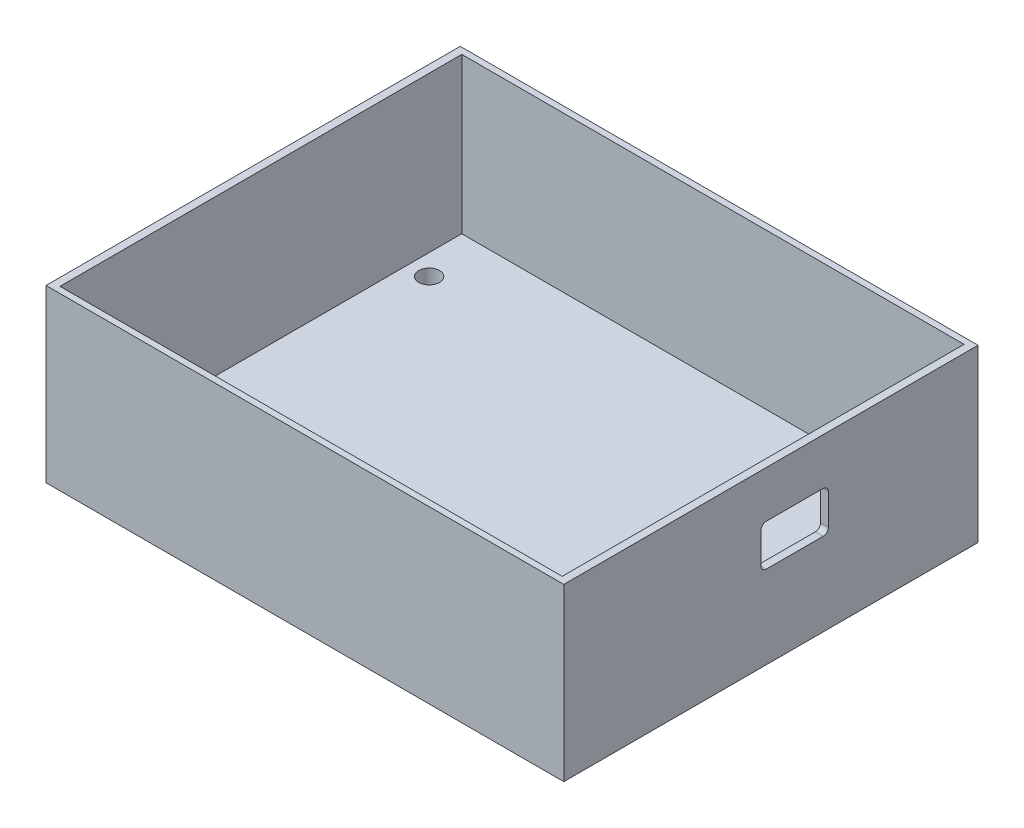
ISO-10303-21;
HEADER;
FILE_DESCRIPTION(('STEP AP214'),'2;1');
FILE_NAME('part.step','',(''),(''),'','','');
FILE_SCHEMA(('AUTOMOTIVE_DESIGN { 1 0 10303 214 1 1 1 1 }'));
ENDSEC;
DATA;
#1=APPLICATION_CONTEXT('core data for automotive mechanical design processes');
#2=APPLICATION_PROTOCOL_DEFINITION('international standard','automotive_design',2000,#1);
#3=PRODUCT_CONTEXT('',#1,'mechanical');
#4=PRODUCT('Part','Part','',(#3));
#5=PRODUCT_RELATED_PRODUCT_CATEGORY('part','',(#4));
#6=PRODUCT_DEFINITION_FORMATION('','',#4);
#7=PRODUCT_DEFINITION_CONTEXT('part definition',#1,'design');
#8=PRODUCT_DEFINITION('design','',#6,#7);
#9=PRODUCT_DEFINITION_SHAPE('','',#8);
#10=(LENGTH_UNIT() NAMED_UNIT(*) SI_UNIT(.MILLI.,.METRE.));
#11=(NAMED_UNIT(*) PLANE_ANGLE_UNIT() SI_UNIT($,.RADIAN.));
#12=(NAMED_UNIT(*) SI_UNIT($,.STERADIAN.) SOLID_ANGLE_UNIT());
#13=UNCERTAINTY_MEASURE_WITH_UNIT(LENGTH_MEASURE(1.E-05),#10,'distance_accuracy_value','');
#14=(GEOMETRIC_REPRESENTATION_CONTEXT(3) GLOBAL_UNCERTAINTY_ASSIGNED_CONTEXT((#13)) GLOBAL_UNIT_ASSIGNED_CONTEXT((#10,
#11,#12)) REPRESENTATION_CONTEXT('',''));
#15=CARTESIAN_POINT('',(0.,0.,0.));
#16=DIRECTION('',(0.,0.,1.));
#17=DIRECTION('',(1.,0.,0.));
#18=AXIS2_PLACEMENT_3D('',#15,#16,#17);
#19=CARTESIAN_POINT('',(40.,17.,-10.1));
#20=DIRECTION('',(-1.,0.,0.));
#21=DIRECTION('',(0.,0.,1.));
#22=AXIS2_PLACEMENT_3D('',#19,#20,#21);
#23=CYLINDRICAL_SURFACE('',#22,1.);
#24=DIRECTION('',(1.,0.,0.));
#25=VECTOR('',#24,1.);
#26=CARTESIAN_POINT('',(40.,17.,-11.1));
#27=LINE('',#26,#25);
#28=CARTESIAN_POINT('',(48.5,17.,-11.1));
#29=VERTEX_POINT('',#28);
#30=CARTESIAN_POINT('',(50.,17.,-11.1));
#31=VERTEX_POINT('',#30);
#32=EDGE_CURVE('E330',#29,#31,#27,.T.);
#33=ORIENTED_EDGE('',*,*,#32,.F.);
#34=CARTESIAN_POINT('',(48.5,17.,-10.1));
#35=DIRECTION('',(-1.,0.,0.));
#36=DIRECTION('',(0.,0.,1.));
#37=AXIS2_PLACEMENT_3D('',#34,#35,#36);
#38=CIRCLE('',#37,1.);
#39=CARTESIAN_POINT('',(48.5,16.,-10.1));
#40=VERTEX_POINT('',#39);
#41=EDGE_CURVE('E39',#29,#40,#38,.T.);
#42=ORIENTED_EDGE('',*,*,#41,.T.);
#43=DIRECTION('',(1.,0.,0.));
#44=VECTOR('',#43,1.);
#45=CARTESIAN_POINT('',(40.,16.,-10.1));
#46=LINE('',#45,#44);
#47=CARTESIAN_POINT('',(50.,16.,-10.1));
#48=VERTEX_POINT('',#47);
#49=EDGE_CURVE('E333',#48,#40,#46,.F.);
#50=ORIENTED_EDGE('',*,*,#49,.F.);
#51=CARTESIAN_POINT('',(50.,17.,-10.1));
#52=DIRECTION('',(-1.,0.,0.));
#53=DIRECTION('',(0.,0.,1.));
#54=AXIS2_PLACEMENT_3D('',#51,#52,#53);
#55=CIRCLE('',#54,1.);
#56=EDGE_CURVE('E11',#48,#31,#55,.F.);
#57=ORIENTED_EDGE('',*,*,#56,.T.);
#58=EDGE_LOOP('',(#33,#42,#50,#57));
#59=FACE_BOUND('',#58,.T.);
#60=ADVANCED_FACE('F32',(#59),#23,.F.);
#61=CARTESIAN_POINT('',(40.,17.,0.899999999999994));
#62=DIRECTION('',(-1.,0.,0.));
#63=DIRECTION('',(0.,0.,1.));
#64=AXIS2_PLACEMENT_3D('',#61,#62,#63);
#65=CYLINDRICAL_SURFACE('',#64,1.);
#66=DIRECTION('',(1.,0.,0.));
#67=VECTOR('',#66,1.);
#68=CARTESIAN_POINT('',(40.,16.,0.899999999999994));
#69=LINE('',#68,#67);
#70=CARTESIAN_POINT('',(48.5,16.,0.899999999999998));
#71=VERTEX_POINT('',#70);
#72=CARTESIAN_POINT('',(50.,16.,0.899999999999994));
#73=VERTEX_POINT('',#72);
#74=EDGE_CURVE('E320',#71,#73,#69,.T.);
#75=ORIENTED_EDGE('',*,*,#74,.F.);
#76=CARTESIAN_POINT('',(48.5,17.,0.899999999999994));
#77=DIRECTION('',(-1.,0.,0.));
#78=DIRECTION('',(0.,0.,1.));
#79=AXIS2_PLACEMENT_3D('',#76,#77,#78);
#80=CIRCLE('',#79,1.);
#81=CARTESIAN_POINT('',(48.5,17.,1.89999999999999));
#82=VERTEX_POINT('',#81);
#83=EDGE_CURVE('E326',#71,#82,#80,.T.);
#84=ORIENTED_EDGE('',*,*,#83,.T.);
#85=DIRECTION('',(1.,0.,0.));
#86=VECTOR('',#85,1.);
#87=CARTESIAN_POINT('',(40.,17.,1.89999999999999));
#88=LINE('',#87,#86);
#89=CARTESIAN_POINT('',(50.,17.,1.89999999999999));
#90=VERTEX_POINT('',#89);
#91=EDGE_CURVE('E323',#90,#82,#88,.F.);
#92=ORIENTED_EDGE('',*,*,#91,.F.);
#93=CARTESIAN_POINT('',(50.,17.,0.899999999999994));
#94=DIRECTION('',(-1.,0.,0.));
#95=DIRECTION('',(0.,0.,1.));
#96=AXIS2_PLACEMENT_3D('',#93,#94,#95);
#97=CIRCLE('',#96,1.);
#98=EDGE_CURVE('E328',#90,#73,#97,.F.);
#99=ORIENTED_EDGE('',*,*,#98,.T.);
#100=EDGE_LOOP('',(#75,#84,#92,#99));
#101=FACE_BOUND('',#100,.T.);
#102=ADVANCED_FACE('F349',(#101),#65,.F.);
#103=CARTESIAN_POINT('',(40.,23.,0.899999999999994));
#104=DIRECTION('',(-1.,0.,0.));
#105=DIRECTION('',(0.,0.,1.));
#106=AXIS2_PLACEMENT_3D('',#103,#104,#105);
#107=CYLINDRICAL_SURFACE('',#106,1.);
#108=DIRECTION('',(1.,0.,0.));
#109=VECTOR('',#108,1.);
#110=CARTESIAN_POINT('',(40.,23.,1.89999999999999));
#111=LINE('',#110,#109);
#112=CARTESIAN_POINT('',(48.5,23.,1.89999999999999));
#113=VERTEX_POINT('',#112);
#114=CARTESIAN_POINT('',(50.,23.,1.89999999999999));
#115=VERTEX_POINT('',#114);
#116=EDGE_CURVE('E310',#113,#115,#111,.T.);
#117=ORIENTED_EDGE('',*,*,#116,.F.);
#118=CARTESIAN_POINT('',(48.5,23.,0.899999999999994));
#119=DIRECTION('',(-1.,0.,0.));
#120=DIRECTION('',(0.,0.,1.));
#121=AXIS2_PLACEMENT_3D('',#118,#119,#120);
#122=CIRCLE('',#121,1.);
#123=CARTESIAN_POINT('',(48.5,24.,0.899999999999998));
#124=VERTEX_POINT('',#123);
#125=EDGE_CURVE('E316',#113,#124,#122,.T.);
#126=ORIENTED_EDGE('',*,*,#125,.T.);
#127=DIRECTION('',(1.,0.,0.));
#128=VECTOR('',#127,1.);
#129=CARTESIAN_POINT('',(40.,24.,0.899999999999994));
#130=LINE('',#129,#128);
#131=CARTESIAN_POINT('',(50.,24.,0.899999999999994));
#132=VERTEX_POINT('',#131);
#133=EDGE_CURVE('E313',#132,#124,#130,.F.);
#134=ORIENTED_EDGE('',*,*,#133,.F.);
#135=CARTESIAN_POINT('',(50.,23.,0.899999999999994));
#136=DIRECTION('',(-1.,0.,0.));
#137=DIRECTION('',(0.,0.,1.));
#138=AXIS2_PLACEMENT_3D('',#135,#136,#137);
#139=CIRCLE('',#138,1.);
#140=EDGE_CURVE('E318',#132,#115,#139,.F.);
#141=ORIENTED_EDGE('',*,*,#140,.T.);
#142=EDGE_LOOP('',(#117,#126,#134,#141));
#143=FACE_BOUND('',#142,.T.);
#144=ADVANCED_FACE('F408',(#143),#107,.F.);
#145=CARTESIAN_POINT('',(40.,23.,-10.1));
#146=DIRECTION('',(1.,0.,0.));
#147=DIRECTION('',(0.,0.,-1.));
#148=AXIS2_PLACEMENT_3D('',#145,#146,#147);
#149=CYLINDRICAL_SURFACE('',#148,1.);
#150=DIRECTION('',(-1.,0.,0.));
#151=VECTOR('',#150,1.);
#152=CARTESIAN_POINT('',(40.,23.,-11.1));
#153=LINE('',#152,#151);
#154=CARTESIAN_POINT('',(50.,23.,-11.1));
#155=VERTEX_POINT('',#154);
#156=CARTESIAN_POINT('',(48.5,23.,-11.1));
#157=VERTEX_POINT('',#156);
#158=EDGE_CURVE('E300',#155,#157,#153,.T.);
#159=ORIENTED_EDGE('',*,*,#158,.F.);
#160=CARTESIAN_POINT('',(50.,23.,-10.1));
#161=DIRECTION('',(-1.,0.,0.));
#162=DIRECTION('',(0.,0.,1.));
#163=AXIS2_PLACEMENT_3D('',#160,#161,#162);
#164=CIRCLE('',#163,1.);
#165=CARTESIAN_POINT('',(50.,24.,-10.1));
#166=VERTEX_POINT('',#165);
#167=EDGE_CURVE('E306',#155,#166,#164,.F.);
#168=ORIENTED_EDGE('',*,*,#167,.T.);
#169=DIRECTION('',(-1.,0.,0.));
#170=VECTOR('',#169,1.);
#171=CARTESIAN_POINT('',(40.,24.,-10.1));
#172=LINE('',#171,#170);
#173=CARTESIAN_POINT('',(48.5,24.,-10.1));
#174=VERTEX_POINT('',#173);
#175=EDGE_CURVE('E303',#174,#166,#172,.F.);
#176=ORIENTED_EDGE('',*,*,#175,.F.);
#177=CARTESIAN_POINT('',(48.5,23.,-10.1));
#178=DIRECTION('',(-1.,0.,0.));
#179=DIRECTION('',(0.,0.,1.));
#180=AXIS2_PLACEMENT_3D('',#177,#178,#179);
#181=CIRCLE('',#180,1.);
#182=EDGE_CURVE('E308',#174,#157,#181,.T.);
#183=ORIENTED_EDGE('',*,*,#182,.T.);
#184=EDGE_LOOP('',(#159,#168,#176,#183));
#185=FACE_BOUND('',#184,.T.);
#186=ADVANCED_FACE('F416',(#185),#149,.F.);
#187=CARTESIAN_POINT('',(50.,3.,40.));
#188=DIRECTION('',(-1.,0.,0.));
#189=DIRECTION('',(0.,0.,1.));
#190=AXIS2_PLACEMENT_3D('',#187,#188,#189);
#191=PLANE('',#190);
#192=DIRECTION('',(0.,0.,1.));
#193=VECTOR('',#192,1.);
#194=CARTESIAN_POINT('',(50.,24.,1.89999999999999));
#195=LINE('',#194,#193);
#196=EDGE_CURVE('E359',#166,#132,#195,.T.);
#197=ORIENTED_EDGE('',*,*,#196,.F.);
#198=ORIENTED_EDGE('',*,*,#167,.F.);
#199=DIRECTION('',(0.,1.,0.));
#200=VECTOR('',#199,1.);
#201=CARTESIAN_POINT('',(50.,16.,-11.1));
#202=LINE('',#201,#200);
#203=EDGE_CURVE('E422',#31,#155,#202,.T.);
#204=ORIENTED_EDGE('',*,*,#203,.F.);
#205=ORIENTED_EDGE('',*,*,#56,.F.);
#206=DIRECTION('',(0.,0.,-1.));
#207=VECTOR('',#206,1.);
#208=CARTESIAN_POINT('',(50.,16.,1.89999999999999));
#209=LINE('',#208,#207);
#210=EDGE_CURVE('E339',#73,#48,#209,.T.);
#211=ORIENTED_EDGE('',*,*,#210,.F.);
#212=ORIENTED_EDGE('',*,*,#98,.F.);
#213=DIRECTION('',(0.,-1.,0.));
#214=VECTOR('',#213,1.);
#215=CARTESIAN_POINT('',(50.,16.,1.89999999999999));
#216=LINE('',#215,#214);
#217=EDGE_CURVE('E354',#115,#90,#216,.T.);
#218=ORIENTED_EDGE('',*,*,#217,.F.);
#219=ORIENTED_EDGE('',*,*,#140,.F.);
#220=EDGE_LOOP('',(#197,#198,#204,#205,#211,#212,#218,#219));
#221=FACE_BOUND('',#220,.T.);
#222=DIRECTION('',(0.,0.,-1.));
#223=VECTOR('',#222,1.);
#224=CARTESIAN_POINT('',(50.,0.,40.));
#225=LINE('',#224,#223);
#226=CARTESIAN_POINT('',(50.,0.,40.));
#227=VERTEX_POINT('',#226);
#228=CARTESIAN_POINT('',(50.,0.,-40.));
#229=VERTEX_POINT('',#228);
#230=EDGE_CURVE('E258',#227,#229,#225,.T.);
#231=ORIENTED_EDGE('',*,*,#230,.T.);
#232=DIRECTION('',(0.,-1.,0.));
#233=VECTOR('',#232,1.);
#234=CARTESIAN_POINT('',(50.,3.,-40.));
#235=LINE('',#234,#233);
#236=CARTESIAN_POINT('',(50.,33.,-40.));
#237=VERTEX_POINT('',#236);
#238=EDGE_CURVE('E276',#237,#229,#235,.T.);
#239=ORIENTED_EDGE('',*,*,#238,.F.);
#240=DIRECTION('',(0.,0.,-1.));
#241=VECTOR('',#240,1.);
#242=CARTESIAN_POINT('',(50.,33.,40.));
#243=LINE('',#242,#241);
#244=CARTESIAN_POINT('',(50.,33.,40.));
#245=VERTEX_POINT('',#244);
#246=EDGE_CURVE('E246',#245,#237,#243,.T.);
#247=ORIENTED_EDGE('',*,*,#246,.F.);
#248=DIRECTION('',(0.,-1.,0.));
#249=VECTOR('',#248,1.);
#250=CARTESIAN_POINT('',(50.,3.,40.));
#251=LINE('',#250,#249);
#252=EDGE_CURVE('E267',#245,#227,#251,.T.);
#253=ORIENTED_EDGE('',*,*,#252,.T.);
#254=EDGE_LOOP('',(#231,#239,#247,#253));
#255=FACE_BOUND('',#254,.T.);
#256=ADVANCED_FACE('F351',(#221,#255),#191,.F.);
#257=CARTESIAN_POINT('',(-50.,3.,-40.));
#258=DIRECTION('',(0.,0.,1.));
#259=DIRECTION('',(1.,0.,0.));
#260=AXIS2_PLACEMENT_3D('',#257,#258,#259);
#261=PLANE('',#260);
#262=DIRECTION('',(-1.,0.,0.));
#263=VECTOR('',#262,1.);
#264=CARTESIAN_POINT('',(-50.,0.,-40.));
#265=LINE('',#264,#263);
#266=CARTESIAN_POINT('',(-50.,0.,-40.));
#267=VERTEX_POINT('',#266);
#268=EDGE_CURVE('E261',#229,#267,#265,.T.);
#269=ORIENTED_EDGE('',*,*,#268,.T.);
#270=DIRECTION('',(0.,-1.,0.));
#271=VECTOR('',#270,1.);
#272=CARTESIAN_POINT('',(-50.,3.,-40.));
#273=LINE('',#272,#271);
#274=CARTESIAN_POINT('',(-50.,33.,-40.));
#275=VERTEX_POINT('',#274);
#276=EDGE_CURVE('E273',#275,#267,#273,.T.);
#277=ORIENTED_EDGE('',*,*,#276,.F.);
#278=DIRECTION('',(-1.,0.,0.));
#279=VECTOR('',#278,1.);
#280=CARTESIAN_POINT('',(-50.,33.,-40.));
#281=LINE('',#280,#279);
#282=EDGE_CURVE('E249',#237,#275,#281,.T.);
#283=ORIENTED_EDGE('',*,*,#282,.F.);
#284=ORIENTED_EDGE('',*,*,#238,.T.);
#285=EDGE_LOOP('',(#269,#277,#283,#284));
#286=FACE_BOUND('',#285,.T.);
#287=ADVANCED_FACE('F555',(#286),#261,.F.);
#288=CARTESIAN_POINT('',(-50.,3.,40.));
#289=DIRECTION('',(1.,0.,0.));
#290=DIRECTION('',(0.,0.,-1.));
#291=AXIS2_PLACEMENT_3D('',#288,#289,#290);
#292=PLANE('',#291);
#293=DIRECTION('',(0.,0.,1.));
#294=VECTOR('',#293,1.);
#295=CARTESIAN_POINT('',(-50.,0.,40.));
#296=LINE('',#295,#294);
#297=CARTESIAN_POINT('',(-50.,0.,40.));
#298=VERTEX_POINT('',#297);
#299=EDGE_CURVE('E263',#267,#298,#296,.T.);
#300=ORIENTED_EDGE('',*,*,#299,.T.);
#301=DIRECTION('',(0.,-1.,0.));
#302=VECTOR('',#301,1.);
#303=CARTESIAN_POINT('',(-50.,3.,40.));
#304=LINE('',#303,#302);
#305=CARTESIAN_POINT('',(-50.,33.,40.));
#306=VERTEX_POINT('',#305);
#307=EDGE_CURVE('E270',#306,#298,#304,.T.);
#308=ORIENTED_EDGE('',*,*,#307,.F.);
#309=DIRECTION('',(0.,0.,1.));
#310=VECTOR('',#309,1.);
#311=CARTESIAN_POINT('',(-50.,33.,40.));
#312=LINE('',#311,#310);
#313=EDGE_CURVE('E252',#275,#306,#312,.T.);
#314=ORIENTED_EDGE('',*,*,#313,.F.);
#315=ORIENTED_EDGE('',*,*,#276,.T.);
#316=EDGE_LOOP('',(#300,#308,#314,#315));
#317=FACE_BOUND('',#316,.T.);
#318=ADVANCED_FACE('F607',(#317),#292,.F.);
#319=CARTESIAN_POINT('',(-50.,3.,40.));
#320=DIRECTION('',(0.,0.,-1.));
#321=DIRECTION('',(-1.,0.,0.));
#322=AXIS2_PLACEMENT_3D('',#319,#320,#321);
#323=PLANE('',#322);
#324=DIRECTION('',(1.,0.,0.));
#325=VECTOR('',#324,1.);
#326=CARTESIAN_POINT('',(-50.,0.,40.));
#327=LINE('',#326,#325);
#328=EDGE_CURVE('E265',#298,#227,#327,.T.);
#329=ORIENTED_EDGE('',*,*,#328,.T.);
#330=ORIENTED_EDGE('',*,*,#252,.F.);
#331=DIRECTION('',(1.,0.,0.));
#332=VECTOR('',#331,1.);
#333=CARTESIAN_POINT('',(-50.,33.,40.));
#334=LINE('',#333,#332);
#335=EDGE_CURVE('E255',#306,#245,#334,.T.);
#336=ORIENTED_EDGE('',*,*,#335,.F.);
#337=ORIENTED_EDGE('',*,*,#307,.T.);
#338=EDGE_LOOP('',(#329,#330,#336,#337));
#339=FACE_BOUND('',#338,.T.);
#340=ADVANCED_FACE('F597',(#339),#323,.F.);
#341=CARTESIAN_POINT('',(0.,0.,0.));
#342=DIRECTION('',(0.,-1.,0.));
#343=DIRECTION('',(0.,0.,-1.));
#344=AXIS2_PLACEMENT_3D('',#341,#342,#343);
#345=PLANE('',#344);
#346=DIRECTION('',(0.,0.,-1.));
#347=VECTOR('',#346,1.);
#348=CARTESIAN_POINT('',(-47.5,0.,0.));
#349=LINE('',#348,#347);
#350=CARTESIAN_POINT('',(-47.5,0.,37.5));
#351=VERTEX_POINT('',#350);
#352=CARTESIAN_POINT('',(-47.5,0.,-37.5));
#353=VERTEX_POINT('',#352);
#354=EDGE_CURVE('E214',#351,#353,#349,.T.);
#355=ORIENTED_EDGE('',*,*,#354,.F.);
#356=DIRECTION('',(-1.,0.,0.));
#357=VECTOR('',#356,1.);
#358=CARTESIAN_POINT('',(0.,0.,37.5));
#359=LINE('',#358,#357);
#360=CARTESIAN_POINT('',(47.5,0.,37.5));
#361=VERTEX_POINT('',#360);
#362=EDGE_CURVE('E172',#361,#351,#359,.T.);
#363=ORIENTED_EDGE('',*,*,#362,.F.);
#364=DIRECTION('',(0.,0.,1.));
#365=VECTOR('',#364,1.);
#366=CARTESIAN_POINT('',(47.5,0.,0.));
#367=LINE('',#366,#365);
#368=CARTESIAN_POINT('',(47.5,0.,-37.5));
#369=VERTEX_POINT('',#368);
#370=EDGE_CURVE('E208',#369,#361,#367,.T.);
#371=ORIENTED_EDGE('',*,*,#370,.F.);
#372=DIRECTION('',(1.,0.,0.));
#373=VECTOR('',#372,1.);
#374=CARTESIAN_POINT('',(0.,0.,-37.5));
#375=LINE('',#374,#373);
#376=EDGE_CURVE('E211',#353,#369,#375,.T.);
#377=ORIENTED_EDGE('',*,*,#376,.F.);
#378=EDGE_LOOP('',(#355,#363,#371,#377));
#379=FACE_BOUND('',#378,.T.);
#380=ORIENTED_EDGE('',*,*,#230,.F.);
#381=ORIENTED_EDGE('',*,*,#328,.F.);
#382=ORIENTED_EDGE('',*,*,#299,.F.);
#383=ORIENTED_EDGE('',*,*,#268,.F.);
#384=EDGE_LOOP('',(#380,#381,#382,#383));
#385=FACE_BOUND('',#384,.T.);
#386=ADVANCED_FACE('F595',(#379,#385),#345,.T.);
#387=CARTESIAN_POINT('',(0.,33.,0.));
#388=DIRECTION('',(0.,-1.,0.));
#389=DIRECTION('',(0.,0.,-1.));
#390=AXIS2_PLACEMENT_3D('',#387,#388,#389);
#391=PLANE('',#390);
#392=ORIENTED_EDGE('',*,*,#246,.T.);
#393=ORIENTED_EDGE('',*,*,#282,.T.);
#394=ORIENTED_EDGE('',*,*,#313,.T.);
#395=ORIENTED_EDGE('',*,*,#335,.T.);
#396=EDGE_LOOP('',(#392,#393,#394,#395));
#397=FACE_BOUND('',#396,.T.);
#398=DIRECTION('',(0.,0.,-1.));
#399=VECTOR('',#398,1.);
#400=CARTESIAN_POINT('',(48.5,33.,38.8));
#401=LINE('',#400,#399);
#402=CARTESIAN_POINT('',(48.5,33.,38.8));
#403=VERTEX_POINT('',#402);
#404=CARTESIAN_POINT('',(48.5,33.,-38.8));
#405=VERTEX_POINT('',#404);
#406=EDGE_CURVE('E217',#403,#405,#401,.T.);
#407=ORIENTED_EDGE('',*,*,#406,.F.);
#408=DIRECTION('',(1.,0.,0.));
#409=VECTOR('',#408,1.);
#410=CARTESIAN_POINT('',(-48.5,33.,38.8));
#411=LINE('',#410,#409);
#412=CARTESIAN_POINT('',(-48.5,33.,38.8));
#413=VERTEX_POINT('',#412);
#414=EDGE_CURVE('E225',#413,#403,#411,.T.);
#415=ORIENTED_EDGE('',*,*,#414,.F.);
#416=DIRECTION('',(0.,0.,1.));
#417=VECTOR('',#416,1.);
#418=CARTESIAN_POINT('',(-48.5,33.,38.8));
#419=LINE('',#418,#417);
#420=CARTESIAN_POINT('',(-48.5,33.,-38.8));
#421=VERTEX_POINT('',#420);
#422=EDGE_CURVE('E222',#421,#413,#419,.T.);
#423=ORIENTED_EDGE('',*,*,#422,.F.);
#424=DIRECTION('',(-1.,0.,0.));
#425=VECTOR('',#424,1.);
#426=CARTESIAN_POINT('',(-48.5,33.,-38.8));
#427=LINE('',#426,#425);
#428=EDGE_CURVE('E219',#405,#421,#427,.T.);
#429=ORIENTED_EDGE('',*,*,#428,.F.);
#430=EDGE_LOOP('',(#407,#415,#423,#429));
#431=FACE_BOUND('',#430,.T.);
#432=ADVANCED_FACE('F393',(#397,#431),#391,.F.);
#433=CARTESIAN_POINT('',(48.5,33.,38.8));
#434=DIRECTION('',(-1.,0.,0.));
#435=DIRECTION('',(0.,0.,1.));
#436=AXIS2_PLACEMENT_3D('',#433,#434,#435);
#437=PLANE('',#436);
#438=DIRECTION('',(0.,-1.,0.));
#439=VECTOR('',#438,1.);
#440=CARTESIAN_POINT('',(48.5,33.,-11.1));
#441=LINE('',#440,#439);
#442=EDGE_CURVE('E297',#157,#29,#441,.T.);
#443=ORIENTED_EDGE('',*,*,#442,.F.);
#444=ORIENTED_EDGE('',*,*,#182,.F.);
#445=DIRECTION('',(0.,0.,-1.));
#446=VECTOR('',#445,1.);
#447=CARTESIAN_POINT('',(48.5,24.,38.8));
#448=LINE('',#447,#446);
#449=EDGE_CURVE('E278',#124,#174,#448,.T.);
#450=ORIENTED_EDGE('',*,*,#449,.F.);
#451=ORIENTED_EDGE('',*,*,#125,.F.);
#452=DIRECTION('',(0.,1.,0.));
#453=VECTOR('',#452,1.);
#454=CARTESIAN_POINT('',(48.5,33.,1.89999999999999));
#455=LINE('',#454,#453);
#456=EDGE_CURVE('E293',#82,#113,#455,.T.);
#457=ORIENTED_EDGE('',*,*,#456,.F.);
#458=ORIENTED_EDGE('',*,*,#83,.F.);
#459=DIRECTION('',(0.,0.,1.));
#460=VECTOR('',#459,1.);
#461=CARTESIAN_POINT('',(48.5,16.,38.8));
#462=LINE('',#461,#460);
#463=EDGE_CURVE('E295',#40,#71,#462,.T.);
#464=ORIENTED_EDGE('',*,*,#463,.F.);
#465=ORIENTED_EDGE('',*,*,#41,.F.);
#466=EDGE_LOOP('',(#443,#444,#450,#451,#457,#458,#464,#465));
#467=FACE_BOUND('',#466,.T.);
#468=DIRECTION('',(0.,0.,-1.));
#469=VECTOR('',#468,1.);
#470=CARTESIAN_POINT('',(48.5,3.,38.8));
#471=LINE('',#470,#469);
#472=CARTESIAN_POINT('',(48.5,3.,38.8));
#473=VERTEX_POINT('',#472);
#474=CARTESIAN_POINT('',(48.5,3.,-38.8));
#475=VERTEX_POINT('',#474);
#476=EDGE_CURVE('E216',#473,#475,#471,.T.);
#477=ORIENTED_EDGE('',*,*,#476,.F.);
#478=DIRECTION('',(0.,-1.,0.));
#479=VECTOR('',#478,1.);
#480=CARTESIAN_POINT('',(48.5,33.,38.8));
#481=LINE('',#480,#479);
#482=EDGE_CURVE('E227',#403,#473,#481,.T.);
#483=ORIENTED_EDGE('',*,*,#482,.F.);
#484=ORIENTED_EDGE('',*,*,#406,.T.);
#485=DIRECTION('',(0.,-1.,0.));
#486=VECTOR('',#485,1.);
#487=CARTESIAN_POINT('',(48.5,33.,-38.8));
#488=LINE('',#487,#486);
#489=EDGE_CURVE('E243',#405,#475,#488,.T.);
#490=ORIENTED_EDGE('',*,*,#489,.T.);
#491=EDGE_LOOP('',(#477,#483,#484,#490));
#492=FACE_BOUND('',#491,.T.);
#493=ADVANCED_FACE('F342',(#467,#492),#437,.T.);
#494=CARTESIAN_POINT('',(-48.5,33.,-38.8));
#495=DIRECTION('',(0.,0.,1.));
#496=DIRECTION('',(1.,0.,0.));
#497=AXIS2_PLACEMENT_3D('',#494,#495,#496);
#498=PLANE('',#497);
#499=DIRECTION('',(-1.,0.,0.));
#500=VECTOR('',#499,1.);
#501=CARTESIAN_POINT('',(-48.5,3.,-38.8));
#502=LINE('',#501,#500);
#503=CARTESIAN_POINT('',(-48.5,3.,-38.8));
#504=VERTEX_POINT('',#503);
#505=EDGE_CURVE('E230',#475,#504,#502,.T.);
#506=ORIENTED_EDGE('',*,*,#505,.F.);
#507=ORIENTED_EDGE('',*,*,#489,.F.);
#508=ORIENTED_EDGE('',*,*,#428,.T.);
#509=DIRECTION('',(0.,-1.,0.));
#510=VECTOR('',#509,1.);
#511=CARTESIAN_POINT('',(-48.5,33.,-38.8));
#512=LINE('',#511,#510);
#513=EDGE_CURVE('E241',#421,#504,#512,.T.);
#514=ORIENTED_EDGE('',*,*,#513,.T.);
#515=EDGE_LOOP('',(#506,#507,#508,#514));
#516=FACE_BOUND('',#515,.T.);
#517=ADVANCED_FACE('F389',(#516),#498,.T.);
#518=CARTESIAN_POINT('',(-48.5,33.,38.8));
#519=DIRECTION('',(1.,0.,0.));
#520=DIRECTION('',(0.,0.,-1.));
#521=AXIS2_PLACEMENT_3D('',#518,#519,#520);
#522=PLANE('',#521);
#523=DIRECTION('',(0.,0.,1.));
#524=VECTOR('',#523,1.);
#525=CARTESIAN_POINT('',(-48.5,3.,38.8));
#526=LINE('',#525,#524);
#527=CARTESIAN_POINT('',(-48.5,3.,38.8));
#528=VERTEX_POINT('',#527);
#529=EDGE_CURVE('E233',#504,#528,#526,.T.);
#530=ORIENTED_EDGE('',*,*,#529,.F.);
#531=ORIENTED_EDGE('',*,*,#513,.F.);
#532=ORIENTED_EDGE('',*,*,#422,.T.);
#533=DIRECTION('',(0.,-1.,0.));
#534=VECTOR('',#533,1.);
#535=CARTESIAN_POINT('',(-48.5,33.,38.8));
#536=LINE('',#535,#534);
#537=EDGE_CURVE('E239',#413,#528,#536,.T.);
#538=ORIENTED_EDGE('',*,*,#537,.T.);
#539=EDGE_LOOP('',(#530,#531,#532,#538));
#540=FACE_BOUND('',#539,.T.);
#541=ADVANCED_FACE('F395',(#540),#522,.T.);
#542=CARTESIAN_POINT('',(-48.5,33.,38.8));
#543=DIRECTION('',(0.,0.,-1.));
#544=DIRECTION('',(-1.,0.,0.));
#545=AXIS2_PLACEMENT_3D('',#542,#543,#544);
#546=PLANE('',#545);
#547=DIRECTION('',(1.,0.,0.));
#548=VECTOR('',#547,1.);
#549=CARTESIAN_POINT('',(-48.5,3.,38.8));
#550=LINE('',#549,#548);
#551=EDGE_CURVE('E220',#528,#473,#550,.T.);
#552=ORIENTED_EDGE('',*,*,#551,.F.);
#553=ORIENTED_EDGE('',*,*,#537,.F.);
#554=ORIENTED_EDGE('',*,*,#414,.T.);
#555=ORIENTED_EDGE('',*,*,#482,.T.);
#556=EDGE_LOOP('',(#552,#553,#554,#555));
#557=FACE_BOUND('',#556,.T.);
#558=ADVANCED_FACE('F373',(#557),#546,.T.);
#559=CARTESIAN_POINT('',(0.,3.,0.));
#560=DIRECTION('',(0.,-1.,0.));
#561=DIRECTION('',(0.,0.,-1.));
#562=AXIS2_PLACEMENT_3D('',#559,#560,#561);
#563=PLANE('',#562);
#564=CARTESIAN_POINT('',(44.5,3.,28.5));
#565=DIRECTION('',(0.,1.,0.));
#566=DIRECTION('',(0.,0.,1.));
#567=AXIS2_PLACEMENT_3D('',#564,#565,#566);
#568=CIRCLE('',#567,2.);
#569=CARTESIAN_POINT('',(44.5,3.,30.5));
#570=VERTEX_POINT('',#569);
#571=EDGE_CURVE('E291',#570,#570,#568,.T.);
#572=ORIENTED_EDGE('',*,*,#571,.F.);
#573=EDGE_LOOP('',(#572));
#574=FACE_BOUND('',#573,.T.);
#575=CARTESIAN_POINT('',(-44.5,3.,28.5));
#576=DIRECTION('',(0.,1.,0.));
#577=DIRECTION('',(0.,0.,1.));
#578=AXIS2_PLACEMENT_3D('',#575,#576,#577);
#579=CIRCLE('',#578,2.);
#580=CARTESIAN_POINT('',(-44.5,3.,30.5));
#581=VERTEX_POINT('',#580);
#582=EDGE_CURVE('E287',#581,#581,#579,.T.);
#583=ORIENTED_EDGE('',*,*,#582,.F.);
#584=EDGE_LOOP('',(#583));
#585=FACE_BOUND('',#584,.T.);
#586=CARTESIAN_POINT('',(44.5,3.,-28.5));
#587=DIRECTION('',(0.,1.,0.));
#588=DIRECTION('',(0.,0.,1.));
#589=AXIS2_PLACEMENT_3D('',#586,#587,#588);
#590=CIRCLE('',#589,2.);
#591=CARTESIAN_POINT('',(44.5,3.,-26.5));
#592=VERTEX_POINT('',#591);
#593=EDGE_CURVE('E283',#592,#592,#590,.T.);
#594=ORIENTED_EDGE('',*,*,#593,.F.);
#595=EDGE_LOOP('',(#594));
#596=FACE_BOUND('',#595,.T.);
#597=CARTESIAN_POINT('',(-44.5,3.,-28.5));
#598=DIRECTION('',(0.,1.,0.));
#599=DIRECTION('',(0.,0.,1.));
#600=AXIS2_PLACEMENT_3D('',#597,#598,#599);
#601=CIRCLE('',#600,2.);
#602=CARTESIAN_POINT('',(-44.5,3.,-26.5));
#603=VERTEX_POINT('',#602);
#604=EDGE_CURVE('E195',#603,#603,#601,.T.);
#605=ORIENTED_EDGE('',*,*,#604,.F.);
#606=EDGE_LOOP('',(#605));
#607=FACE_BOUND('',#606,.T.);
#608=ORIENTED_EDGE('',*,*,#551,.T.);
#609=ORIENTED_EDGE('',*,*,#476,.T.);
#610=ORIENTED_EDGE('',*,*,#505,.T.);
#611=ORIENTED_EDGE('',*,*,#529,.T.);
#612=EDGE_LOOP('',(#608,#609,#610,#611));
#613=FACE_BOUND('',#612,.T.);
#614=ADVANCED_FACE('F370',(#574,#585,#596,#607,#613),#563,.F.);
#615=CARTESIAN_POINT('',(-47.5,-1.99999999999999,37.5));
#616=DIRECTION('',(-1.,0.,0.));
#617=DIRECTION('',(0.,0.,1.));
#618=AXIS2_PLACEMENT_3D('',#615,#616,#617);
#619=PLANE('',#618);
#620=DIRECTION('',(0.,1.,0.));
#621=VECTOR('',#620,1.);
#622=CARTESIAN_POINT('',(-47.5,-1.99999999999999,37.5));
#623=LINE('',#622,#621);
#624=CARTESIAN_POINT('',(-47.5,-1.99999999999999,37.5));
#625=VERTEX_POINT('',#624);
#626=EDGE_CURVE('E167',#625,#351,#623,.T.);
#627=ORIENTED_EDGE('',*,*,#626,.T.);
#628=ORIENTED_EDGE('',*,*,#354,.T.);
#629=DIRECTION('',(0.,1.,0.));
#630=VECTOR('',#629,1.);
#631=CARTESIAN_POINT('',(-47.5,-1.99999999999999,-37.5));
#632=LINE('',#631,#630);
#633=CARTESIAN_POINT('',(-47.5,-1.99999999999999,-37.5));
#634=VERTEX_POINT('',#633);
#635=EDGE_CURVE('E191',#634,#353,#632,.T.);
#636=ORIENTED_EDGE('',*,*,#635,.F.);
#637=DIRECTION('',(0.,0.,1.));
#638=VECTOR('',#637,1.);
#639=CARTESIAN_POINT('',(-47.5,-1.99999999999999,37.5));
#640=LINE('',#639,#638);
#641=EDGE_CURVE('E184',#634,#625,#640,.T.);
#642=ORIENTED_EDGE('',*,*,#641,.T.);
#643=EDGE_LOOP('',(#627,#628,#636,#642));
#644=FACE_BOUND('',#643,.T.);
#645=ADVANCED_FACE('F189',(#644),#619,.T.);
#646=CARTESIAN_POINT('',(47.5,-1.99999999999999,-37.5));
#647=DIRECTION('',(0.,0.,-1.));
#648=DIRECTION('',(-1.,0.,0.));
#649=AXIS2_PLACEMENT_3D('',#646,#647,#648);
#650=PLANE('',#649);
#651=ORIENTED_EDGE('',*,*,#635,.T.);
#652=ORIENTED_EDGE('',*,*,#376,.T.);
#653=DIRECTION('',(0.,1.,0.));
#654=VECTOR('',#653,1.);
#655=CARTESIAN_POINT('',(47.5,-1.99999999999999,-37.5));
#656=LINE('',#655,#654);
#657=CARTESIAN_POINT('',(47.5,-1.99999999999999,-37.5));
#658=VERTEX_POINT('',#657);
#659=EDGE_CURVE('E203',#658,#369,#656,.T.);
#660=ORIENTED_EDGE('',*,*,#659,.F.);
#661=DIRECTION('',(-1.,0.,0.));
#662=VECTOR('',#661,1.);
#663=CARTESIAN_POINT('',(47.5,-1.99999999999999,-37.5));
#664=LINE('',#663,#662);
#665=EDGE_CURVE('E177',#658,#634,#664,.T.);
#666=ORIENTED_EDGE('',*,*,#665,.T.);
#667=EDGE_LOOP('',(#651,#652,#660,#666));
#668=FACE_BOUND('',#667,.T.);
#669=ADVANCED_FACE('F456',(#668),#650,.T.);
#670=CARTESIAN_POINT('',(47.5,-1.99999999999999,37.5));
#671=DIRECTION('',(1.,0.,0.));
#672=DIRECTION('',(0.,0.,-1.));
#673=AXIS2_PLACEMENT_3D('',#670,#671,#672);
#674=PLANE('',#673);
#675=ORIENTED_EDGE('',*,*,#659,.T.);
#676=ORIENTED_EDGE('',*,*,#370,.T.);
#677=DIRECTION('',(0.,1.,0.));
#678=VECTOR('',#677,1.);
#679=CARTESIAN_POINT('',(47.5,-1.99999999999999,37.5));
#680=LINE('',#679,#678);
#681=CARTESIAN_POINT('',(47.5,-1.99999999999999,37.5));
#682=VERTEX_POINT('',#681);
#683=EDGE_CURVE('E176',#682,#361,#680,.T.);
#684=ORIENTED_EDGE('',*,*,#683,.F.);
#685=DIRECTION('',(0.,0.,-1.));
#686=VECTOR('',#685,1.);
#687=CARTESIAN_POINT('',(47.5,-1.99999999999999,37.5));
#688=LINE('',#687,#686);
#689=EDGE_CURVE('E187',#682,#658,#688,.T.);
#690=ORIENTED_EDGE('',*,*,#689,.T.);
#691=EDGE_LOOP('',(#675,#676,#684,#690));
#692=FACE_BOUND('',#691,.T.);
#693=ADVANCED_FACE('F459',(#692),#674,.T.);
#694=CARTESIAN_POINT('',(47.5,-1.99999999999999,37.5));
#695=DIRECTION('',(0.,0.,1.));
#696=DIRECTION('',(1.,0.,0.));
#697=AXIS2_PLACEMENT_3D('',#694,#695,#696);
#698=PLANE('',#697);
#699=ORIENTED_EDGE('',*,*,#683,.T.);
#700=ORIENTED_EDGE('',*,*,#362,.T.);
#701=ORIENTED_EDGE('',*,*,#626,.F.);
#702=DIRECTION('',(1.,0.,0.));
#703=VECTOR('',#702,1.);
#704=CARTESIAN_POINT('',(47.5,-1.99999999999999,37.5));
#705=LINE('',#704,#703);
#706=EDGE_CURVE('E171',#625,#682,#705,.T.);
#707=ORIENTED_EDGE('',*,*,#706,.T.);
#708=EDGE_LOOP('',(#699,#700,#701,#707));
#709=FACE_BOUND('',#708,.T.);
#710=ADVANCED_FACE('F170',(#709),#698,.T.);
#711=CARTESIAN_POINT('',(0.,-1.99999999999999,0.));
#712=DIRECTION('',(0.,1.,0.));
#713=DIRECTION('',(0.,0.,1.));
#714=AXIS2_PLACEMENT_3D('',#711,#712,#713);
#715=PLANE('',#714);
#716=CARTESIAN_POINT('',(44.5,-1.99999999999999,28.5));
#717=DIRECTION('',(0.,1.,0.));
#718=DIRECTION('',(0.,0.,1.));
#719=AXIS2_PLACEMENT_3D('',#716,#717,#718);
#720=CIRCLE('',#719,2.);
#721=CARTESIAN_POINT('',(44.5,-1.99999999999999,30.5));
#722=VERTEX_POINT('',#721);
#723=EDGE_CURVE('E288',#722,#722,#720,.T.);
#724=ORIENTED_EDGE('',*,*,#723,.T.);
#725=EDGE_LOOP('',(#724));
#726=FACE_BOUND('',#725,.T.);
#727=CARTESIAN_POINT('',(-44.5,-1.99999999999999,28.5));
#728=DIRECTION('',(0.,1.,0.));
#729=DIRECTION('',(0.,0.,1.));
#730=AXIS2_PLACEMENT_3D('',#727,#728,#729);
#731=CIRCLE('',#730,2.);
#732=CARTESIAN_POINT('',(-44.5,-1.99999999999999,30.5));
#733=VERTEX_POINT('',#732);
#734=EDGE_CURVE('E284',#733,#733,#731,.T.);
#735=ORIENTED_EDGE('',*,*,#734,.T.);
#736=EDGE_LOOP('',(#735));
#737=FACE_BOUND('',#736,.T.);
#738=CARTESIAN_POINT('',(44.5,-1.99999999999999,-28.5));
#739=DIRECTION('',(0.,1.,0.));
#740=DIRECTION('',(0.,0.,1.));
#741=AXIS2_PLACEMENT_3D('',#738,#739,#740);
#742=CIRCLE('',#741,2.);
#743=CARTESIAN_POINT('',(44.5,-1.99999999999999,-26.5));
#744=VERTEX_POINT('',#743);
#745=EDGE_CURVE('E280',#744,#744,#742,.T.);
#746=ORIENTED_EDGE('',*,*,#745,.T.);
#747=EDGE_LOOP('',(#746));
#748=FACE_BOUND('',#747,.T.);
#749=CARTESIAN_POINT('',(-44.5,-1.99999999999999,-28.5));
#750=DIRECTION('',(0.,1.,0.));
#751=DIRECTION('',(0.,0.,1.));
#752=AXIS2_PLACEMENT_3D('',#749,#750,#751);
#753=CIRCLE('',#752,2.);
#754=CARTESIAN_POINT('',(-44.5,-1.99999999999999,-26.5));
#755=VERTEX_POINT('',#754);
#756=EDGE_CURVE('E192',#755,#755,#753,.T.);
#757=ORIENTED_EDGE('',*,*,#756,.T.);
#758=EDGE_LOOP('',(#757));
#759=FACE_BOUND('',#758,.T.);
#760=ORIENTED_EDGE('',*,*,#641,.F.);
#761=ORIENTED_EDGE('',*,*,#665,.F.);
#762=ORIENTED_EDGE('',*,*,#689,.F.);
#763=ORIENTED_EDGE('',*,*,#706,.F.);
#764=EDGE_LOOP('',(#760,#761,#762,#763));
#765=FACE_BOUND('',#764,.T.);
#766=ADVANCED_FACE('F182',(#726,#737,#748,#759,#765),#715,.F.);
#767=CARTESIAN_POINT('',(-44.5,-8.99999999999999,-28.5));
#768=DIRECTION('',(0.,1.,0.));
#769=DIRECTION('',(0.,0.,1.));
#770=AXIS2_PLACEMENT_3D('',#767,#768,#769);
#771=CYLINDRICAL_SURFACE('',#770,2.);
#772=ORIENTED_EDGE('',*,*,#604,.T.);
#773=EDGE_LOOP('',(#772));
#774=FACE_BOUND('',#773,.T.);
#775=ORIENTED_EDGE('',*,*,#756,.F.);
#776=EDGE_LOOP('',(#775));
#777=FACE_BOUND('',#776,.T.);
#778=ADVANCED_FACE('F449',(#774,#777),#771,.F.);
#779=CARTESIAN_POINT('',(44.5,-8.99999999999999,-28.5));
#780=DIRECTION('',(0.,1.,0.));
#781=DIRECTION('',(0.,0.,1.));
#782=AXIS2_PLACEMENT_3D('',#779,#780,#781);
#783=CYLINDRICAL_SURFACE('',#782,2.);
#784=ORIENTED_EDGE('',*,*,#593,.T.);
#785=EDGE_LOOP('',(#784));
#786=FACE_BOUND('',#785,.T.);
#787=ORIENTED_EDGE('',*,*,#745,.F.);
#788=EDGE_LOOP('',(#787));
#789=FACE_BOUND('',#788,.T.);
#790=ADVANCED_FACE('F367',(#786,#789),#783,.F.);
#791=CARTESIAN_POINT('',(-44.5,-8.99999999999999,28.5));
#792=DIRECTION('',(0.,1.,0.));
#793=DIRECTION('',(0.,0.,1.));
#794=AXIS2_PLACEMENT_3D('',#791,#792,#793);
#795=CYLINDRICAL_SURFACE('',#794,2.);
#796=ORIENTED_EDGE('',*,*,#582,.T.);
#797=EDGE_LOOP('',(#796));
#798=FACE_BOUND('',#797,.T.);
#799=ORIENTED_EDGE('',*,*,#734,.F.);
#800=EDGE_LOOP('',(#799));
#801=FACE_BOUND('',#800,.T.);
#802=ADVANCED_FACE('F442',(#798,#801),#795,.F.);
#803=CARTESIAN_POINT('',(44.5,-8.99999999999999,28.5));
#804=DIRECTION('',(0.,1.,0.));
#805=DIRECTION('',(0.,0.,1.));
#806=AXIS2_PLACEMENT_3D('',#803,#804,#805);
#807=CYLINDRICAL_SURFACE('',#806,2.);
#808=ORIENTED_EDGE('',*,*,#571,.T.);
#809=EDGE_LOOP('',(#808));
#810=FACE_BOUND('',#809,.T.);
#811=ORIENTED_EDGE('',*,*,#723,.F.);
#812=EDGE_LOOP('',(#811));
#813=FACE_BOUND('',#812,.T.);
#814=ADVANCED_FACE('F439',(#810,#813),#807,.F.);
#815=CARTESIAN_POINT('',(40.,16.,-11.1));
#816=DIRECTION('',(0.,0.,-1.));
#817=DIRECTION('',(-1.,0.,0.));
#818=AXIS2_PLACEMENT_3D('',#815,#816,#817);
#819=PLANE('',#818);
#820=ORIENTED_EDGE('',*,*,#442,.T.);
#821=ORIENTED_EDGE('',*,*,#32,.T.);
#822=ORIENTED_EDGE('',*,*,#203,.T.);
#823=ORIENTED_EDGE('',*,*,#158,.T.);
#824=EDGE_LOOP('',(#820,#821,#822,#823));
#825=FACE_BOUND('',#824,.T.);
#826=ADVANCED_FACE('F410',(#825),#819,.F.);
#827=CARTESIAN_POINT('',(40.,16.,1.89999999999999));
#828=DIRECTION('',(0.,-1.,0.));
#829=DIRECTION('',(0.,0.,-1.));
#830=AXIS2_PLACEMENT_3D('',#827,#828,#829);
#831=PLANE('',#830);
#832=ORIENTED_EDGE('',*,*,#210,.T.);
#833=ORIENTED_EDGE('',*,*,#49,.T.);
#834=ORIENTED_EDGE('',*,*,#463,.T.);
#835=ORIENTED_EDGE('',*,*,#74,.T.);
#836=EDGE_LOOP('',(#832,#833,#834,#835));
#837=FACE_BOUND('',#836,.T.);
#838=ADVANCED_FACE('F337',(#837),#831,.F.);
#839=CARTESIAN_POINT('',(40.,16.,1.89999999999999));
#840=DIRECTION('',(0.,0.,1.));
#841=DIRECTION('',(1.,0.,0.));
#842=AXIS2_PLACEMENT_3D('',#839,#840,#841);
#843=PLANE('',#842);
#844=ORIENTED_EDGE('',*,*,#217,.T.);
#845=ORIENTED_EDGE('',*,*,#91,.T.);
#846=ORIENTED_EDGE('',*,*,#456,.T.);
#847=ORIENTED_EDGE('',*,*,#116,.T.);
#848=EDGE_LOOP('',(#844,#845,#846,#847));
#849=FACE_BOUND('',#848,.T.);
#850=ADVANCED_FACE('F427',(#849),#843,.F.);
#851=CARTESIAN_POINT('',(40.,24.,1.89999999999999));
#852=DIRECTION('',(0.,1.,0.));
#853=DIRECTION('',(0.,0.,1.));
#854=AXIS2_PLACEMENT_3D('',#851,#852,#853);
#855=PLANE('',#854);
#856=ORIENTED_EDGE('',*,*,#196,.T.);
#857=ORIENTED_EDGE('',*,*,#133,.T.);
#858=ORIENTED_EDGE('',*,*,#449,.T.);
#859=ORIENTED_EDGE('',*,*,#175,.T.);
#860=EDGE_LOOP('',(#856,#857,#858,#859));
#861=FACE_BOUND('',#860,.T.);
#862=ADVANCED_FACE('F420',(#861),#855,.F.);
#863=CLOSED_SHELL('',(#60,#102,#144,#186,#256,#287,#318,#340,#386,#432,#493,#517,#541,#558,#614,
#645,#669,#693,#710,#766,#778,#790,#802,#814,#826,#838,#850,#862));
#864=MANIFOLD_SOLID_BREP('B2',#863);
#865=ADVANCED_BREP_SHAPE_REPRESENTATION('',(#18,#864),#14);
#866=SHAPE_DEFINITION_REPRESENTATION(#9,#865);
ENDSEC;
END-ISO-10303-21;
